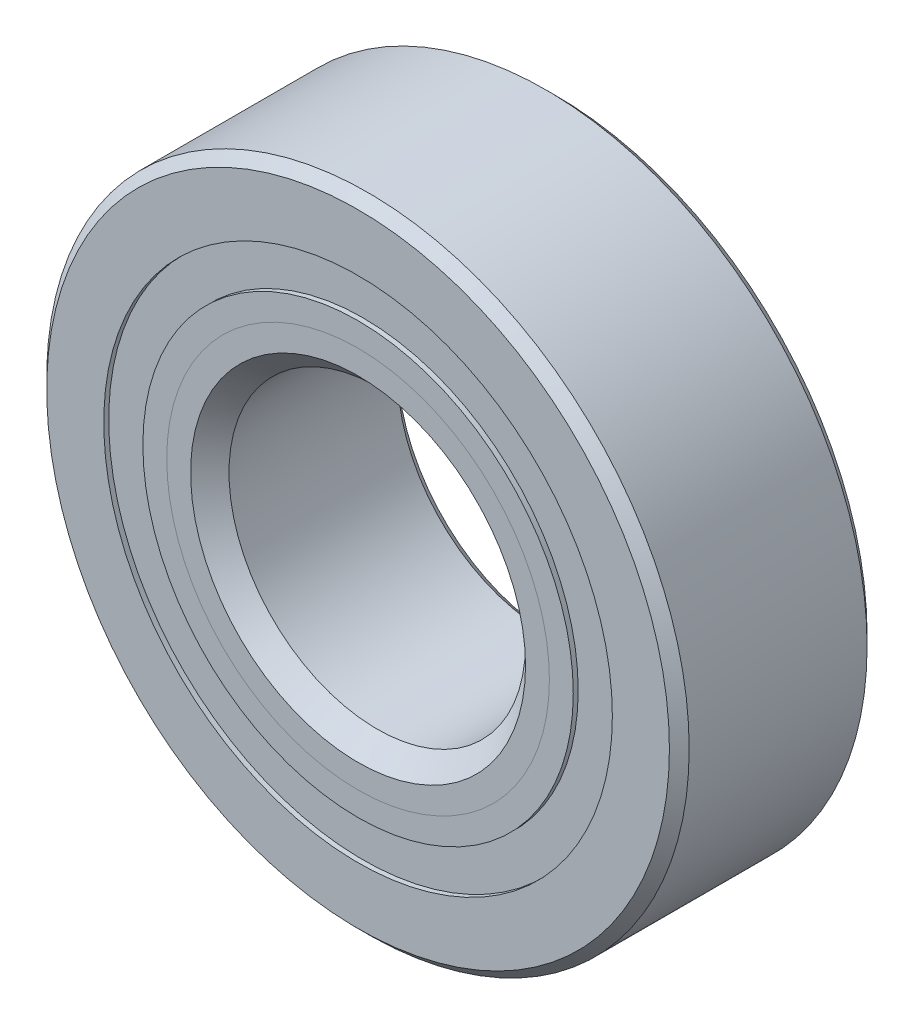
ISO-10303-21;
HEADER;
FILE_DESCRIPTION(('STEP AP214'),'2;1');
FILE_NAME('part.step','',(''),(''),'','','');
FILE_SCHEMA(('AUTOMOTIVE_DESIGN { 1 0 10303 214 1 1 1 1 }'));
ENDSEC;
DATA;
#1=APPLICATION_CONTEXT('core data for automotive mechanical design processes');
#2=APPLICATION_PROTOCOL_DEFINITION('international standard','automotive_design',2000,#1);
#3=PRODUCT_CONTEXT('',#1,'mechanical');
#4=PRODUCT('Part','Part','',(#3));
#5=PRODUCT_RELATED_PRODUCT_CATEGORY('part','',(#4));
#6=PRODUCT_DEFINITION_FORMATION('','',#4);
#7=PRODUCT_DEFINITION_CONTEXT('part definition',#1,'design');
#8=PRODUCT_DEFINITION('design','',#6,#7);
#9=PRODUCT_DEFINITION_SHAPE('','',#8);
#10=(LENGTH_UNIT() NAMED_UNIT(*) SI_UNIT(.MILLI.,.METRE.));
#11=(NAMED_UNIT(*) PLANE_ANGLE_UNIT() SI_UNIT($,.RADIAN.));
#12=(NAMED_UNIT(*) SI_UNIT($,.STERADIAN.) SOLID_ANGLE_UNIT());
#13=UNCERTAINTY_MEASURE_WITH_UNIT(LENGTH_MEASURE(1.E-05),#10,'distance_accuracy_value','');
#14=(GEOMETRIC_REPRESENTATION_CONTEXT(3) GLOBAL_UNCERTAINTY_ASSIGNED_CONTEXT((#13)) GLOBAL_UNIT_ASSIGNED_CONTEXT((#10,
#11,#12)) REPRESENTATION_CONTEXT('',''));
#15=CARTESIAN_POINT('',(0.,0.,0.));
#16=DIRECTION('',(0.,0.,1.));
#17=DIRECTION('',(1.,0.,0.));
#18=AXIS2_PLACEMENT_3D('',#15,#16,#17);
#19=CARTESIAN_POINT('',(0.,16.337293956044,-6.0325));
#20=DIRECTION('',(0.,0.,1.));
#21=DIRECTION('',(1.,0.,0.));
#22=AXIS2_PLACEMENT_3D('',#19,#20,#21);
#23=PLANE('',#22);
#24=CARTESIAN_POINT('',(0.,0.,-6.0325));
#25=DIRECTION('',(0.,0.,1.));
#26=DIRECTION('',(1.,0.,0.));
#27=AXIS2_PLACEMENT_3D('',#24,#25,#26);
#28=CIRCLE('',#27,16.337293956044);
#29=CARTESIAN_POINT('',(16.337293956044,0.,-6.0325));
#30=VERTEX_POINT('',#29);
#31=EDGE_CURVE('E55',#30,#30,#28,.T.);
#32=ORIENTED_EDGE('',*,*,#31,.F.);
#33=EDGE_LOOP('',(#32));
#34=FACE_BOUND('',#33,.T.);
#35=CARTESIAN_POINT('',(0.,0.,-6.0325));
#36=DIRECTION('',(0.,0.,1.));
#37=DIRECTION('',(1.,0.,0.));
#38=AXIS2_PLACEMENT_3D('',#35,#36,#37);
#39=CIRCLE('',#38,13.8252060439561);
#40=CARTESIAN_POINT('',(13.8252060439561,0.,-6.0325));
#41=VERTEX_POINT('',#40);
#42=EDGE_CURVE('E11',#41,#41,#39,.T.);
#43=ORIENTED_EDGE('',*,*,#42,.T.);
#44=EDGE_LOOP('',(#43));
#45=FACE_BOUND('',#44,.T.);
#46=ADVANCED_FACE('F41',(#34,#45),#23,.F.);
#47=CARTESIAN_POINT('',(0.,0.,6.35));
#48=DIRECTION('',(0.,0.,1.));
#49=DIRECTION('',(1.,0.,0.));
#50=AXIS2_PLACEMENT_3D('',#47,#48,#49);
#51=CYLINDRICAL_SURFACE('',#50,13.8252060439561);
#52=ORIENTED_EDGE('',*,*,#42,.F.);
#53=EDGE_LOOP('',(#52));
#54=FACE_BOUND('',#53,.T.);
#55=CARTESIAN_POINT('',(0.,0.,-3.08910742628344));
#56=DIRECTION('',(0.,0.,1.));
#57=DIRECTION('',(1.,0.,0.));
#58=AXIS2_PLACEMENT_3D('',#55,#56,#57);
#59=CIRCLE('',#58,13.8252060439561);
#60=CARTESIAN_POINT('',(13.8252060439561,0.,-3.08910742628344));
#61=VERTEX_POINT('',#60);
#62=EDGE_CURVE('E47',#61,#61,#59,.T.);
#63=ORIENTED_EDGE('',*,*,#62,.T.);
#64=EDGE_LOOP('',(#63));
#65=FACE_BOUND('',#64,.T.);
#66=ADVANCED_FACE('F64',(#54,#65),#51,.F.);
#67=CARTESIAN_POINT('',(0.,16.337293956044,-3.08910742628344));
#68=DIRECTION('',(0.,0.,-1.));
#69=DIRECTION('',(-1.,0.,0.));
#70=AXIS2_PLACEMENT_3D('',#67,#68,#69);
#71=PLANE('',#70);
#72=ORIENTED_EDGE('',*,*,#62,.F.);
#73=EDGE_LOOP('',(#72));
#74=FACE_BOUND('',#73,.T.);
#75=CARTESIAN_POINT('',(0.,0.,-3.08910742628344));
#76=DIRECTION('',(0.,0.,1.));
#77=DIRECTION('',(1.,0.,0.));
#78=AXIS2_PLACEMENT_3D('',#75,#76,#77);
#79=CIRCLE('',#78,16.337293956044);
#80=CARTESIAN_POINT('',(16.337293956044,0.,-3.08910742628344));
#81=VERTEX_POINT('',#80);
#82=EDGE_CURVE('E51',#81,#81,#79,.T.);
#83=ORIENTED_EDGE('',*,*,#82,.T.);
#84=EDGE_LOOP('',(#83));
#85=FACE_BOUND('',#84,.T.);
#86=ADVANCED_FACE('F68',(#74,#85),#71,.F.);
#87=CARTESIAN_POINT('',(0.,0.,6.35));
#88=DIRECTION('',(0.,0.,1.));
#89=DIRECTION('',(1.,0.,0.));
#90=AXIS2_PLACEMENT_3D('',#87,#88,#89);
#91=CYLINDRICAL_SURFACE('',#90,16.337293956044);
#92=ORIENTED_EDGE('',*,*,#82,.F.);
#93=EDGE_LOOP('',(#92));
#94=FACE_BOUND('',#93,.T.);
#95=ORIENTED_EDGE('',*,*,#31,.T.);
#96=EDGE_LOOP('',(#95));
#97=FACE_BOUND('',#96,.T.);
#98=ADVANCED_FACE('F61',(#94,#97),#91,.T.);
#99=CLOSED_SHELL('',(#46,#66,#86,#98));
#100=MANIFOLD_SOLID_BREP('B2',#99);
#101=CARTESIAN_POINT('',(0.,16.337293956044,6.0325));
#102=DIRECTION('',(0.,0.,-1.));
#103=DIRECTION('',(-1.,0.,0.));
#104=AXIS2_PLACEMENT_3D('',#101,#102,#103);
#105=PLANE('',#104);
#106=CARTESIAN_POINT('',(0.,0.,6.0325));
#107=DIRECTION('',(0.,0.,1.));
#108=DIRECTION('',(1.,0.,0.));
#109=AXIS2_PLACEMENT_3D('',#106,#107,#108);
#110=CIRCLE('',#109,13.8252060439561);
#111=CARTESIAN_POINT('',(13.8252060439561,0.,6.0325));
#112=VERTEX_POINT('',#111);
#113=EDGE_CURVE('E40',#112,#112,#110,.T.);
#114=ORIENTED_EDGE('',*,*,#113,.F.);
#115=EDGE_LOOP('',(#114));
#116=FACE_BOUND('',#115,.T.);
#117=CARTESIAN_POINT('',(0.,0.,6.0325));
#118=DIRECTION('',(0.,0.,1.));
#119=DIRECTION('',(1.,0.,0.));
#120=AXIS2_PLACEMENT_3D('',#117,#118,#119);
#121=CIRCLE('',#120,16.337293956044);
#122=CARTESIAN_POINT('',(16.337293956044,0.,6.0325));
#123=VERTEX_POINT('',#122);
#124=EDGE_CURVE('E122',#123,#123,#121,.T.);
#125=ORIENTED_EDGE('',*,*,#124,.T.);
#126=EDGE_LOOP('',(#125));
#127=FACE_BOUND('',#126,.T.);
#128=ADVANCED_FACE('F108',(#116,#127),#105,.F.);
#129=CARTESIAN_POINT('',(0.,0.,6.35));
#130=DIRECTION('',(0.,0.,1.));
#131=DIRECTION('',(1.,0.,0.));
#132=AXIS2_PLACEMENT_3D('',#129,#130,#131);
#133=CYLINDRICAL_SURFACE('',#132,13.8252060439561);
#134=CARTESIAN_POINT('',(0.,0.,3.08910742628344));
#135=DIRECTION('',(0.,0.,1.));
#136=DIRECTION('',(1.,0.,0.));
#137=AXIS2_PLACEMENT_3D('',#134,#135,#136);
#138=CIRCLE('',#137,13.8252060439561);
#139=CARTESIAN_POINT('',(13.8252060439561,0.,3.08910742628344));
#140=VERTEX_POINT('',#139);
#141=EDGE_CURVE('E114',#140,#140,#138,.T.);
#142=ORIENTED_EDGE('',*,*,#141,.F.);
#143=EDGE_LOOP('',(#142));
#144=FACE_BOUND('',#143,.T.);
#145=ORIENTED_EDGE('',*,*,#113,.T.);
#146=EDGE_LOOP('',(#145));
#147=FACE_BOUND('',#146,.T.);
#148=ADVANCED_FACE('F137',(#144,#147),#133,.F.);
#149=CARTESIAN_POINT('',(0.,16.337293956044,3.08910742628344));
#150=DIRECTION('',(0.,0.,1.));
#151=DIRECTION('',(1.,0.,0.));
#152=AXIS2_PLACEMENT_3D('',#149,#150,#151);
#153=PLANE('',#152);
#154=CARTESIAN_POINT('',(0.,0.,3.08910742628344));
#155=DIRECTION('',(0.,0.,1.));
#156=DIRECTION('',(1.,0.,0.));
#157=AXIS2_PLACEMENT_3D('',#154,#155,#156);
#158=CIRCLE('',#157,16.337293956044);
#159=CARTESIAN_POINT('',(16.337293956044,0.,3.08910742628344));
#160=VERTEX_POINT('',#159);
#161=EDGE_CURVE('E118',#160,#160,#158,.T.);
#162=ORIENTED_EDGE('',*,*,#161,.F.);
#163=EDGE_LOOP('',(#162));
#164=FACE_BOUND('',#163,.T.);
#165=ORIENTED_EDGE('',*,*,#141,.T.);
#166=EDGE_LOOP('',(#165));
#167=FACE_BOUND('',#166,.T.);
#168=ADVANCED_FACE('F132',(#164,#167),#153,.F.);
#169=CARTESIAN_POINT('',(0.,0.,6.35));
#170=DIRECTION('',(0.,0.,1.));
#171=DIRECTION('',(1.,0.,0.));
#172=AXIS2_PLACEMENT_3D('',#169,#170,#171);
#173=CYLINDRICAL_SURFACE('',#172,16.337293956044);
#174=ORIENTED_EDGE('',*,*,#124,.F.);
#175=EDGE_LOOP('',(#174));
#176=FACE_BOUND('',#175,.T.);
#177=ORIENTED_EDGE('',*,*,#161,.T.);
#178=EDGE_LOOP('',(#177));
#179=FACE_BOUND('',#178,.T.);
#180=ADVANCED_FACE('F129',(#176,#179),#173,.T.);
#181=CLOSED_SHELL('',(#128,#148,#168,#180));
#182=MANIFOLD_SOLID_BREP('B6',#181);
#183=CARTESIAN_POINT('',(-6.5435091405665,13.5877367390534,0.));
#184=DIRECTION('',(0.,0.,1.));
#185=DIRECTION('',(-0.433883739117546,0.900968867902425,0.));
#186=AXIS2_PLACEMENT_3D('',#183,#184,#185);
#187=SPHERICAL_SURFACE('',#186,3.08910742628344);
#188=CARTESIAN_POINT('',(-6.5435091405665,13.5877367390534,3.08910742628344));
#189=VERTEX_POINT('',#188);
#190=VERTEX_LOOP('',#189);
#191=FACE_BOUND('',#190,.T.);
#192=ADVANCED_FACE('F175',(#191),#187,.T.);
#193=CLOSED_SHELL('',(#192));
#194=MANIFOLD_SOLID_BREP('B35',#193);
#195=CARTESIAN_POINT('',(-11.7909960449709,9.40300557428217,0.));
#196=DIRECTION('',(0.,0.,1.));
#197=DIRECTION('',(-0.781831482468022,0.623489801858743,0.));
#198=AXIS2_PLACEMENT_3D('',#195,#196,#197);
#199=SPHERICAL_SURFACE('',#198,3.08910742628344);
#200=CARTESIAN_POINT('',(-11.7909960449709,9.40300557428217,3.08910742628344));
#201=VERTEX_POINT('',#200);
#202=VERTEX_LOOP('',#201);
#203=FACE_BOUND('',#202,.T.);
#204=ADVANCED_FACE('F195',(#203),#199,.T.);
#205=CLOSED_SHELL('',(#204));
#206=MANIFOLD_SOLID_BREP('B104',#205);
#207=CARTESIAN_POINT('',(-14.7031315755921,3.35589383522882,0.));
#208=DIRECTION('',(0.,0.,1.));
#209=DIRECTION('',(-0.974927912181821,0.222520933956325,0.));
#210=AXIS2_PLACEMENT_3D('',#207,#208,#209);
#211=SPHERICAL_SURFACE('',#210,3.08910742628344);
#212=CARTESIAN_POINT('',(-14.7031315755921,3.35589383522882,3.08910742628344));
#213=VERTEX_POINT('',#212);
#214=VERTEX_LOOP('',#213);
#215=FACE_BOUND('',#214,.T.);
#216=ADVANCED_FACE('F215',(#215),#211,.T.);
#217=CLOSED_SHELL('',(#216));
#218=MANIFOLD_SOLID_BREP('B171',#217);
#219=CARTESIAN_POINT('',(-14.7031315755922,-3.35589383522853,0.));
#220=DIRECTION('',(0.,0.,1.));
#221=DIRECTION('',(-0.974927912181826,-0.222520933956305,0.));
#222=AXIS2_PLACEMENT_3D('',#219,#220,#221);
#223=SPHERICAL_SURFACE('',#222,3.08910742628344);
#224=CARTESIAN_POINT('',(-14.7031315755922,-3.35589383522853,3.08910742628344));
#225=VERTEX_POINT('',#224);
#226=VERTEX_LOOP('',#225);
#227=FACE_BOUND('',#226,.T.);
#228=ADVANCED_FACE('F246',(#227),#223,.T.);
#229=CLOSED_SHELL('',(#228));
#230=MANIFOLD_SOLID_BREP('B191',#229);
#231=CARTESIAN_POINT('',(-11.7909960449711,-9.40300557428192,0.));
#232=DIRECTION('',(0.,0.,1.));
#233=DIRECTION('',(-0.781831482468035,-0.623489801858727,0.));
#234=AXIS2_PLACEMENT_3D('',#231,#232,#233);
#235=SPHERICAL_SURFACE('',#234,3.08910742628344);
#236=CARTESIAN_POINT('',(-11.7909960449711,-9.40300557428192,3.08910742628344));
#237=VERTEX_POINT('',#236);
#238=VERTEX_LOOP('',#237);
#239=FACE_BOUND('',#238,.T.);
#240=ADVANCED_FACE('F275',(#239),#235,.T.);
#241=CLOSED_SHELL('',(#240));
#242=MANIFOLD_SOLID_BREP('B211',#241);
#243=CARTESIAN_POINT('',(-6.54350914056678,-13.5877367390533,0.));
#244=DIRECTION('',(0.,0.,1.));
#245=DIRECTION('',(-0.433883739117565,-0.900968867902416,0.));
#246=AXIS2_PLACEMENT_3D('',#243,#244,#245);
#247=SPHERICAL_SURFACE('',#246,3.08910742628344);
#248=CARTESIAN_POINT('',(-6.54350914056678,-13.5877367390533,3.08910742628344));
#249=VERTEX_POINT('',#248);
#250=VERTEX_LOOP('',#249);
#251=FACE_BOUND('',#250,.T.);
#252=ADVANCED_FACE('F306',(#251),#247,.T.);
#253=CLOSED_SHELL('',(#252));
#254=MANIFOLD_SOLID_BREP('B242',#253);
#255=CARTESIAN_POINT('',(-1.05311866879462E-13,-15.08125,0.));
#256=DIRECTION('',(0.,0.,1.));
#257=DIRECTION('',(0.,-1.,0.));
#258=AXIS2_PLACEMENT_3D('',#255,#256,#257);
#259=SPHERICAL_SURFACE('',#258,3.08910742628344);
#260=CARTESIAN_POINT('',(-1.05311866879462E-13,-15.08125,3.08910742628344));
#261=VERTEX_POINT('',#260);
#262=VERTEX_LOOP('',#261);
#263=FACE_BOUND('',#262,.T.);
#264=ADVANCED_FACE('F337',(#263),#259,.T.);
#265=CLOSED_SHELL('',(#264));
#266=MANIFOLD_SOLID_BREP('B271',#265);
#267=CARTESIAN_POINT('',(6.54350914056659,-13.5877367390534,0.));
#268=DIRECTION('',(0.,0.,1.));
#269=DIRECTION('',(0.433883739117553,-0.900968867902422,0.));
#270=AXIS2_PLACEMENT_3D('',#267,#268,#269);
#271=SPHERICAL_SURFACE('',#270,3.08910742628344);
#272=CARTESIAN_POINT('',(6.54350914056659,-13.5877367390534,3.08910742628344));
#273=VERTEX_POINT('',#272);
#274=VERTEX_LOOP('',#273);
#275=FACE_BOUND('',#274,.T.);
#276=ADVANCED_FACE('F368',(#275),#271,.T.);
#277=CLOSED_SHELL('',(#276));
#278=MANIFOLD_SOLID_BREP('B302',#277);
#279=CARTESIAN_POINT('',(11.7909960449709,-9.40300557428208,0.));
#280=DIRECTION('',(0.,0.,1.));
#281=DIRECTION('',(0.781831482468027,-0.623489801858737,0.));
#282=AXIS2_PLACEMENT_3D('',#279,#280,#281);
#283=SPHERICAL_SURFACE('',#282,3.08910742628344);
#284=CARTESIAN_POINT('',(11.7909960449709,-9.40300557428208,3.08910742628344));
#285=VERTEX_POINT('',#284);
#286=VERTEX_LOOP('',#285);
#287=FACE_BOUND('',#286,.T.);
#288=ADVANCED_FACE('F399',(#287),#283,.T.);
#289=CLOSED_SHELL('',(#288));
#290=MANIFOLD_SOLID_BREP('B333',#289);
#291=CARTESIAN_POINT('',(14.7031315755921,-3.35589383522872,0.));
#292=DIRECTION('',(0.,0.,1.));
#293=DIRECTION('',(0.974927912181823,-0.222520933956318,0.));
#294=AXIS2_PLACEMENT_3D('',#291,#292,#293);
#295=SPHERICAL_SURFACE('',#294,3.08910742628344);
#296=CARTESIAN_POINT('',(14.7031315755921,-3.35589383522872,3.08910742628344));
#297=VERTEX_POINT('',#296);
#298=VERTEX_LOOP('',#297);
#299=FACE_BOUND('',#298,.T.);
#300=ADVANCED_FACE('F428',(#299),#295,.T.);
#301=CLOSED_SHELL('',(#300));
#302=MANIFOLD_SOLID_BREP('B364',#301);
#303=CARTESIAN_POINT('',(14.7031315755921,3.35589383522862,0.));
#304=DIRECTION('',(0.,0.,1.));
#305=DIRECTION('',(0.974927912181824,0.222520933956311,0.));
#306=AXIS2_PLACEMENT_3D('',#303,#304,#305);
#307=SPHERICAL_SURFACE('',#306,3.08910742628344);
#308=CARTESIAN_POINT('',(14.7031315755921,3.35589383522862,3.08910742628344));
#309=VERTEX_POINT('',#308);
#310=VERTEX_LOOP('',#309);
#311=FACE_BOUND('',#310,.T.);
#312=ADVANCED_FACE('F457',(#311),#307,.T.);
#313=CLOSED_SHELL('',(#312));
#314=MANIFOLD_SOLID_BREP('B395',#313);
#315=CARTESIAN_POINT('',(11.790996044971,9.403005574282,0.));
#316=DIRECTION('',(0.,0.,1.));
#317=DIRECTION('',(0.781831482468031,0.623489801858732,0.));
#318=AXIS2_PLACEMENT_3D('',#315,#316,#317);
#319=SPHERICAL_SURFACE('',#318,3.08910742628344);
#320=CARTESIAN_POINT('',(11.790996044971,9.403005574282,3.08910742628344));
#321=VERTEX_POINT('',#320);
#322=VERTEX_LOOP('',#321);
#323=FACE_BOUND('',#322,.T.);
#324=ADVANCED_FACE('F486',(#323),#319,.T.);
#325=CLOSED_SHELL('',(#324));
#326=MANIFOLD_SOLID_BREP('B424',#325);
#327=CARTESIAN_POINT('',(6.54350914056669,13.5877367390534,0.));
#328=DIRECTION('',(0.,0.,1.));
#329=DIRECTION('',(0.433883739117559,0.900968867902419,0.));
#330=AXIS2_PLACEMENT_3D('',#327,#328,#329);
#331=SPHERICAL_SURFACE('',#330,3.08910742628344);
#332=CARTESIAN_POINT('',(6.54350914056669,13.5877367390534,3.08910742628344));
#333=VERTEX_POINT('',#332);
#334=VERTEX_LOOP('',#333);
#335=FACE_BOUND('',#334,.T.);
#336=ADVANCED_FACE('F515',(#335),#331,.T.);
#337=CLOSED_SHELL('',(#336));
#338=MANIFOLD_SOLID_BREP('B453',#337);
#339=CARTESIAN_POINT('',(0.,15.08125,0.));
#340=DIRECTION('',(0.,0.,1.));
#341=DIRECTION('',(0.,1.,0.));
#342=AXIS2_PLACEMENT_3D('',#339,#340,#341);
#343=SPHERICAL_SURFACE('',#342,3.08910742628344);
#344=CARTESIAN_POINT('',(0.,15.08125,3.08910742628344));
#345=VERTEX_POINT('',#344);
#346=VERTEX_LOOP('',#345);
#347=FACE_BOUND('',#346,.T.);
#348=ADVANCED_FACE('F548',(#347),#343,.T.);
#349=CLOSED_SHELL('',(#348));
#350=MANIFOLD_SOLID_BREP('B482',#349);
#351=CARTESIAN_POINT('',(0.,12.2918886654072,6.35));
#352=DIRECTION('',(0.,0.,-1.));
#353=DIRECTION('',(-1.,0.,0.));
#354=AXIS2_PLACEMENT_3D('',#351,#352,#353);
#355=PLANE('',#354);
#356=CARTESIAN_POINT('',(0.,0.,6.35));
#357=DIRECTION('',(0.,0.,1.));
#358=DIRECTION('',(1.,0.,0.));
#359=AXIS2_PLACEMENT_3D('',#356,#357,#358);
#360=CIRCLE('',#359,10.7585712868583);
#361=CARTESIAN_POINT('',(10.7585712868583,0.,6.35));
#362=VERTEX_POINT('',#361);
#363=EDGE_CURVE('E602',#362,#362,#360,.T.);
#364=ORIENTED_EDGE('',*,*,#363,.F.);
#365=EDGE_LOOP('',(#364));
#366=FACE_BOUND('',#365,.T.);
#367=CARTESIAN_POINT('',(0.,0.,6.35));
#368=DIRECTION('',(0.,0.,1.));
#369=DIRECTION('',(1.,0.,0.));
#370=AXIS2_PLACEMENT_3D('',#367,#368,#369);
#371=CIRCLE('',#370,12.2918886654072);
#372=CARTESIAN_POINT('',(12.2918886654072,0.,6.35));
#373=VERTEX_POINT('',#372);
#374=EDGE_CURVE('E547',#373,#373,#371,.T.);
#375=ORIENTED_EDGE('',*,*,#374,.T.);
#376=EDGE_LOOP('',(#375));
#377=FACE_BOUND('',#376,.T.);
#378=ADVANCED_FACE('F568',(#366,#377),#355,.F.);
#379=CARTESIAN_POINT('',(0.,0.,4.81668262145112));
#380=DIRECTION('',(0.,0.,1.));
#381=DIRECTION('',(1.,0.,0.));
#382=AXIS2_PLACEMENT_3D('',#379,#380,#381);
#383=CONICAL_SURFACE('',#382,10.7585712868583,0.78539816339745);
#384=ORIENTED_EDGE('',*,*,#374,.F.);
#385=EDGE_LOOP('',(#384));
#386=FACE_BOUND('',#385,.T.);
#387=CARTESIAN_POINT('',(0.,0.,4.81668262145112));
#388=DIRECTION('',(0.,0.,1.));
#389=DIRECTION('',(1.,0.,0.));
#390=AXIS2_PLACEMENT_3D('',#387,#388,#389);
#391=CIRCLE('',#390,10.7585712868583);
#392=CARTESIAN_POINT('',(10.7585712868583,0.,4.81668262145112));
#393=VERTEX_POINT('',#392);
#394=EDGE_CURVE('E574',#393,#393,#391,.T.);
#395=ORIENTED_EDGE('',*,*,#394,.T.);
#396=EDGE_LOOP('',(#395));
#397=FACE_BOUND('',#396,.T.);
#398=ADVANCED_FACE('F609',(#386,#397),#383,.T.);
#399=CARTESIAN_POINT('',(0.,0.,6.35));
#400=DIRECTION('',(0.,0.,1.));
#401=DIRECTION('',(1.,0.,0.));
#402=AXIS2_PLACEMENT_3D('',#399,#400,#401);
#403=CYLINDRICAL_SURFACE('',#402,10.7585712868583);
#404=ORIENTED_EDGE('',*,*,#394,.F.);
#405=EDGE_LOOP('',(#404));
#406=FACE_BOUND('',#405,.T.);
#407=CARTESIAN_POINT('',(0.,0.,0.));
#408=DIRECTION('',(0.,0.,1.));
#409=DIRECTION('',(1.,0.,0.));
#410=AXIS2_PLACEMENT_3D('',#407,#408,#409);
#411=CIRCLE('',#410,10.7585712868583);
#412=CARTESIAN_POINT('',(10.7585712868583,0.,0.));
#413=VERTEX_POINT('',#412);
#414=EDGE_CURVE('E578',#413,#413,#411,.T.);
#415=ORIENTED_EDGE('',*,*,#414,.T.);
#416=EDGE_LOOP('',(#415));
#417=FACE_BOUND('',#416,.T.);
#418=ADVANCED_FACE('F613',(#406,#417),#403,.T.);
#419=CARTESIAN_POINT('',(0.,10.7585712868583,0.));
#420=DIRECTION('',(0.,0.,-1.));
#421=DIRECTION('',(-1.,0.,0.));
#422=AXIS2_PLACEMENT_3D('',#419,#420,#421);
#423=PLANE('',#422);
#424=ORIENTED_EDGE('',*,*,#414,.F.);
#425=EDGE_LOOP('',(#424));
#426=FACE_BOUND('',#425,.T.);
#427=CARTESIAN_POINT('',(0.,0.,0.));
#428=DIRECTION('',(0.,0.,1.));
#429=DIRECTION('',(1.,0.,0.));
#430=AXIS2_PLACEMENT_3D('',#427,#428,#429);
#431=CIRCLE('',#430,11.9921425737166);
#432=CARTESIAN_POINT('',(11.9921425737166,0.,0.));
#433=VERTEX_POINT('',#432);
#434=EDGE_CURVE('E582',#433,#433,#431,.T.);
#435=ORIENTED_EDGE('',*,*,#434,.T.);
#436=EDGE_LOOP('',(#435));
#437=FACE_BOUND('',#436,.T.);
#438=ADVANCED_FACE('F618',(#426,#437),#423,.F.);
#439=CARTESIAN_POINT('',(0.,0.,0.));
#440=DIRECTION('',(0.,0.,1.));
#441=DIRECTION('',(1.,0.,0.));
#442=AXIS2_PLACEMENT_3D('',#439,#440,#441);
#443=TOROIDAL_SURFACE('',#442,15.08125,3.08910742628344);
#444=ORIENTED_EDGE('',*,*,#434,.F.);
#445=EDGE_LOOP('',(#444));
#446=FACE_BOUND('',#445,.T.);
#447=CARTESIAN_POINT('',(0.,0.,-2.82222222222222));
#448=DIRECTION('',(0.,0.,1.));
#449=DIRECTION('',(1.,0.,0.));
#450=AXIS2_PLACEMENT_3D('',#447,#448,#449);
#451=CIRCLE('',#450,13.8252060439561);
#452=CARTESIAN_POINT('',(13.8252060439561,0.,-2.82222222222222));
#453=VERTEX_POINT('',#452);
#454=EDGE_CURVE('E587',#453,#453,#451,.T.);
#455=ORIENTED_EDGE('',*,*,#454,.T.);
#456=EDGE_LOOP('',(#455));
#457=FACE_BOUND('',#456,.T.);
#458=ADVANCED_FACE('F624',(#446,#457),#443,.F.);
#459=CARTESIAN_POINT('',(0.,0.,6.35));
#460=DIRECTION('',(0.,0.,1.));
#461=DIRECTION('',(1.,0.,0.));
#462=AXIS2_PLACEMENT_3D('',#459,#460,#461);
#463=CYLINDRICAL_SURFACE('',#462,13.8252060439561);
#464=ORIENTED_EDGE('',*,*,#454,.F.);
#465=EDGE_LOOP('',(#464));
#466=FACE_BOUND('',#465,.T.);
#467=CARTESIAN_POINT('',(0.,0.,-6.35));
#468=DIRECTION('',(0.,0.,1.));
#469=DIRECTION('',(1.,0.,0.));
#470=AXIS2_PLACEMENT_3D('',#467,#468,#469);
#471=CIRCLE('',#470,13.8252060439561);
#472=CARTESIAN_POINT('',(13.8252060439561,0.,-6.35));
#473=VERTEX_POINT('',#472);
#474=EDGE_CURVE('E590',#473,#473,#471,.T.);
#475=ORIENTED_EDGE('',*,*,#474,.T.);
#476=EDGE_LOOP('',(#475));
#477=FACE_BOUND('',#476,.T.);
#478=ADVANCED_FACE('F628',(#466,#477),#463,.T.);
#479=CARTESIAN_POINT('',(0.,10.16,-6.35));
#480=DIRECTION('',(0.,0.,1.));
#481=DIRECTION('',(1.,0.,0.));
#482=AXIS2_PLACEMENT_3D('',#479,#480,#481);
#483=PLANE('',#482);
#484=ORIENTED_EDGE('',*,*,#474,.F.);
#485=EDGE_LOOP('',(#484));
#486=FACE_BOUND('',#485,.T.);
#487=CARTESIAN_POINT('',(0.,0.,-6.35));
#488=DIRECTION('',(0.,0.,1.));
#489=DIRECTION('',(1.,0.,0.));
#490=AXIS2_PLACEMENT_3D('',#487,#488,#489);
#491=CIRCLE('',#490,10.16);
#492=CARTESIAN_POINT('',(10.16,0.,-6.35));
#493=VERTEX_POINT('',#492);
#494=EDGE_CURVE('E593',#493,#493,#491,.T.);
#495=ORIENTED_EDGE('',*,*,#494,.T.);
#496=EDGE_LOOP('',(#495));
#497=FACE_BOUND('',#496,.T.);
#498=ADVANCED_FACE('F632',(#486,#497),#483,.F.);
#499=CARTESIAN_POINT('',(0.,0.,-5.715));
#500=DIRECTION('',(0.,0.,-1.));
#501=DIRECTION('',(-1.,0.,0.));
#502=AXIS2_PLACEMENT_3D('',#499,#500,#501);
#503=CONICAL_SURFACE('',#502,9.525,0.785398163397446);
#504=ORIENTED_EDGE('',*,*,#494,.F.);
#505=EDGE_LOOP('',(#504));
#506=FACE_BOUND('',#505,.T.);
#507=CARTESIAN_POINT('',(0.,0.,-5.715));
#508=DIRECTION('',(0.,0.,1.));
#509=DIRECTION('',(1.,0.,0.));
#510=AXIS2_PLACEMENT_3D('',#507,#508,#509);
#511=CIRCLE('',#510,9.525);
#512=CARTESIAN_POINT('',(9.525,0.,-5.715));
#513=VERTEX_POINT('',#512);
#514=EDGE_CURVE('E596',#513,#513,#511,.T.);
#515=ORIENTED_EDGE('',*,*,#514,.T.);
#516=EDGE_LOOP('',(#515));
#517=FACE_BOUND('',#516,.T.);
#518=ADVANCED_FACE('F636',(#506,#517),#503,.F.);
#519=CARTESIAN_POINT('',(0.,0.,6.35));
#520=DIRECTION('',(0.,0.,1.));
#521=DIRECTION('',(1.,0.,0.));
#522=AXIS2_PLACEMENT_3D('',#519,#520,#521);
#523=CYLINDRICAL_SURFACE('',#522,9.525);
#524=ORIENTED_EDGE('',*,*,#514,.F.);
#525=EDGE_LOOP('',(#524));
#526=FACE_BOUND('',#525,.T.);
#527=CARTESIAN_POINT('',(0.,0.,5.11642871314173));
#528=DIRECTION('',(0.,0.,1.));
#529=DIRECTION('',(1.,0.,0.));
#530=AXIS2_PLACEMENT_3D('',#527,#528,#529);
#531=CIRCLE('',#530,9.525);
#532=CARTESIAN_POINT('',(9.525,0.,5.11642871314173));
#533=VERTEX_POINT('',#532);
#534=EDGE_CURVE('E599',#533,#533,#531,.T.);
#535=ORIENTED_EDGE('',*,*,#534,.T.);
#536=EDGE_LOOP('',(#535));
#537=FACE_BOUND('',#536,.T.);
#538=ADVANCED_FACE('F640',(#526,#537),#523,.F.);
#539=CARTESIAN_POINT('',(0.,0.,6.35));
#540=DIRECTION('',(0.,0.,1.));
#541=DIRECTION('',(1.,0.,0.));
#542=AXIS2_PLACEMENT_3D('',#539,#540,#541);
#543=CONICAL_SURFACE('',#542,10.7585712868583,0.78539816339745);
#544=ORIENTED_EDGE('',*,*,#534,.F.);
#545=EDGE_LOOP('',(#544));
#546=FACE_BOUND('',#545,.T.);
#547=ORIENTED_EDGE('',*,*,#363,.T.);
#548=EDGE_LOOP('',(#547));
#549=FACE_BOUND('',#548,.T.);
#550=ADVANCED_FACE('F606',(#546,#549),#543,.F.);
#551=CLOSED_SHELL('',(#378,#398,#418,#438,#458,#478,#498,#518,#538,#550));
#552=MANIFOLD_SOLID_BREP('B511',#551);
#553=CARTESIAN_POINT('',(0.,13.8252060439561,6.35));
#554=DIRECTION('',(0.,0.,-1.));
#555=DIRECTION('',(-1.,0.,0.));
#556=AXIS2_PLACEMENT_3D('',#553,#554,#555);
#557=PLANE('',#556);
#558=CARTESIAN_POINT('',(0.,0.,6.35));
#559=DIRECTION('',(0.,0.,1.));
#560=DIRECTION('',(1.,0.,0.));
#561=AXIS2_PLACEMENT_3D('',#558,#559,#560);
#562=CIRCLE('',#561,12.2918886654072);
#563=CARTESIAN_POINT('',(12.2918886654072,0.,6.35));
#564=VERTEX_POINT('',#563);
#565=EDGE_CURVE('E567',#564,#564,#562,.T.);
#566=ORIENTED_EDGE('',*,*,#565,.F.);
#567=EDGE_LOOP('',(#566));
#568=FACE_BOUND('',#567,.T.);
#569=CARTESIAN_POINT('',(0.,0.,6.35));
#570=DIRECTION('',(0.,0.,1.));
#571=DIRECTION('',(1.,0.,0.));
#572=AXIS2_PLACEMENT_3D('',#569,#570,#571);
#573=CIRCLE('',#572,13.8252060439561);
#574=CARTESIAN_POINT('',(13.8252060439561,0.,6.35));
#575=VERTEX_POINT('',#574);
#576=EDGE_CURVE('E748',#575,#575,#573,.T.);
#577=ORIENTED_EDGE('',*,*,#576,.T.);
#578=EDGE_LOOP('',(#577));
#579=FACE_BOUND('',#578,.T.);
#580=ADVANCED_FACE('F726',(#568,#579),#557,.F.);
#581=CARTESIAN_POINT('',(0.,0.,6.35));
#582=DIRECTION('',(0.,0.,1.));
#583=DIRECTION('',(1.,0.,0.));
#584=AXIS2_PLACEMENT_3D('',#581,#582,#583);
#585=CONICAL_SURFACE('',#584,12.2918886654072,0.78539816339745);
#586=CARTESIAN_POINT('',(0.,0.,4.81668262145112));
#587=DIRECTION('',(0.,0.,1.));
#588=DIRECTION('',(1.,0.,0.));
#589=AXIS2_PLACEMENT_3D('',#586,#587,#588);
#590=CIRCLE('',#589,10.7585712868583);
#591=CARTESIAN_POINT('',(10.7585712868583,0.,4.81668262145112));
#592=VERTEX_POINT('',#591);
#593=EDGE_CURVE('E732',#592,#592,#590,.T.);
#594=ORIENTED_EDGE('',*,*,#593,.F.);
#595=EDGE_LOOP('',(#594));
#596=FACE_BOUND('',#595,.T.);
#597=ORIENTED_EDGE('',*,*,#565,.T.);
#598=EDGE_LOOP('',(#597));
#599=FACE_BOUND('',#598,.T.);
#600=ADVANCED_FACE('F773',(#596,#599),#585,.F.);
#601=CARTESIAN_POINT('',(0.,0.,6.35));
#602=DIRECTION('',(0.,0.,1.));
#603=DIRECTION('',(1.,0.,0.));
#604=AXIS2_PLACEMENT_3D('',#601,#602,#603);
#605=CYLINDRICAL_SURFACE('',#604,10.7585712868583);
#606=CARTESIAN_POINT('',(0.,0.,0.));
#607=DIRECTION('',(0.,0.,1.));
#608=DIRECTION('',(1.,0.,0.));
#609=AXIS2_PLACEMENT_3D('',#606,#607,#608);
#610=CIRCLE('',#609,10.7585712868583);
#611=CARTESIAN_POINT('',(10.7585712868583,0.,0.));
#612=VERTEX_POINT('',#611);
#613=EDGE_CURVE('E736',#612,#612,#610,.T.);
#614=ORIENTED_EDGE('',*,*,#613,.F.);
#615=EDGE_LOOP('',(#614));
#616=FACE_BOUND('',#615,.T.);
#617=ORIENTED_EDGE('',*,*,#593,.T.);
#618=EDGE_LOOP('',(#617));
#619=FACE_BOUND('',#618,.T.);
#620=ADVANCED_FACE('F768',(#616,#619),#605,.F.);
#621=CARTESIAN_POINT('',(0.,10.7585712868583,0.));
#622=DIRECTION('',(0.,0.,1.));
#623=DIRECTION('',(1.,0.,0.));
#624=AXIS2_PLACEMENT_3D('',#621,#622,#623);
#625=PLANE('',#624);
#626=CARTESIAN_POINT('',(0.,0.,0.));
#627=DIRECTION('',(0.,0.,1.));
#628=DIRECTION('',(1.,0.,0.));
#629=AXIS2_PLACEMENT_3D('',#626,#627,#628);
#630=CIRCLE('',#629,11.9921425737166);
#631=CARTESIAN_POINT('',(11.9921425737166,0.,0.));
#632=VERTEX_POINT('',#631);
#633=EDGE_CURVE('E740',#632,#632,#630,.T.);
#634=ORIENTED_EDGE('',*,*,#633,.F.);
#635=EDGE_LOOP('',(#634));
#636=FACE_BOUND('',#635,.T.);
#637=ORIENTED_EDGE('',*,*,#613,.T.);
#638=EDGE_LOOP('',(#637));
#639=FACE_BOUND('',#638,.T.);
#640=ADVANCED_FACE('F762',(#636,#639),#625,.F.);
#641=CARTESIAN_POINT('',(0.,0.,0.));
#642=DIRECTION('',(0.,0.,1.));
#643=DIRECTION('',(1.,0.,0.));
#644=AXIS2_PLACEMENT_3D('',#641,#642,#643);
#645=TOROIDAL_SURFACE('',#644,15.08125,3.08910742628344);
#646=CARTESIAN_POINT('',(0.,0.,2.82222222222222));
#647=DIRECTION('',(0.,0.,1.));
#648=DIRECTION('',(1.,0.,0.));
#649=AXIS2_PLACEMENT_3D('',#646,#647,#648);
#650=CIRCLE('',#649,13.8252060439561);
#651=CARTESIAN_POINT('',(13.8252060439561,0.,2.82222222222222));
#652=VERTEX_POINT('',#651);
#653=EDGE_CURVE('E745',#652,#652,#650,.T.);
#654=ORIENTED_EDGE('',*,*,#653,.F.);
#655=EDGE_LOOP('',(#654));
#656=FACE_BOUND('',#655,.T.);
#657=ORIENTED_EDGE('',*,*,#633,.T.);
#658=EDGE_LOOP('',(#657));
#659=FACE_BOUND('',#658,.T.);
#660=ADVANCED_FACE('F756',(#656,#659),#645,.F.);
#661=CARTESIAN_POINT('',(0.,0.,6.35));
#662=DIRECTION('',(0.,0.,1.));
#663=DIRECTION('',(1.,0.,0.));
#664=AXIS2_PLACEMENT_3D('',#661,#662,#663);
#665=CYLINDRICAL_SURFACE('',#664,13.8252060439561);
#666=ORIENTED_EDGE('',*,*,#576,.F.);
#667=EDGE_LOOP('',(#666));
#668=FACE_BOUND('',#667,.T.);
#669=ORIENTED_EDGE('',*,*,#653,.T.);
#670=EDGE_LOOP('',(#669));
#671=FACE_BOUND('',#670,.T.);
#672=ADVANCED_FACE('F753',(#668,#671),#665,.T.);
#673=CLOSED_SHELL('',(#580,#600,#620,#640,#660,#672));
#674=MANIFOLD_SOLID_BREP('B542',#673);
#675=CARTESIAN_POINT('',(0.,0.,5.715));
#676=DIRECTION('',(0.,0.,-1.));
#677=DIRECTION('',(-1.,0.,0.));
#678=AXIS2_PLACEMENT_3D('',#675,#676,#677);
#679=CONICAL_SURFACE('',#678,20.6375,0.785398163397448);
#680=CARTESIAN_POINT('',(0.,0.,6.35));
#681=DIRECTION('',(0.,0.,1.));
#682=DIRECTION('',(1.,0.,0.));
#683=AXIS2_PLACEMENT_3D('',#680,#681,#682);
#684=CIRCLE('',#683,20.0025);
#685=CARTESIAN_POINT('',(20.0025,0.,6.35));
#686=VERTEX_POINT('',#685);
#687=EDGE_CURVE('E845',#686,#686,#684,.T.);
#688=ORIENTED_EDGE('',*,*,#687,.F.);
#689=EDGE_LOOP('',(#688));
#690=FACE_BOUND('',#689,.T.);
#691=CARTESIAN_POINT('',(0.,0.,5.715));
#692=DIRECTION('',(0.,0.,1.));
#693=DIRECTION('',(1.,0.,0.));
#694=AXIS2_PLACEMENT_3D('',#691,#692,#693);
#695=CIRCLE('',#694,20.6375);
#696=CARTESIAN_POINT('',(20.6375,0.,5.715));
#697=VERTEX_POINT('',#696);
#698=EDGE_CURVE('E725',#697,#697,#695,.T.);
#699=ORIENTED_EDGE('',*,*,#698,.T.);
#700=EDGE_LOOP('',(#699));
#701=FACE_BOUND('',#700,.T.);
#702=ADVANCED_FACE('F817',(#690,#701),#679,.T.);
#703=CARTESIAN_POINT('',(0.,0.,6.35));
#704=DIRECTION('',(0.,0.,1.));
#705=DIRECTION('',(1.,0.,0.));
#706=AXIS2_PLACEMENT_3D('',#703,#704,#705);
#707=CYLINDRICAL_SURFACE('',#706,20.6375);
#708=ORIENTED_EDGE('',*,*,#698,.F.);
#709=EDGE_LOOP('',(#708));
#710=FACE_BOUND('',#709,.T.);
#711=CARTESIAN_POINT('',(0.,0.,-5.715));
#712=DIRECTION('',(0.,0.,1.));
#713=DIRECTION('',(1.,0.,0.));
#714=AXIS2_PLACEMENT_3D('',#711,#712,#713);
#715=CIRCLE('',#714,20.6375);
#716=CARTESIAN_POINT('',(20.6375,0.,-5.715));
#717=VERTEX_POINT('',#716);
#718=EDGE_CURVE('E823',#717,#717,#715,.T.);
#719=ORIENTED_EDGE('',*,*,#718,.T.);
#720=EDGE_LOOP('',(#719));
#721=FACE_BOUND('',#720,.T.);
#722=ADVANCED_FACE('F852',(#710,#721),#707,.T.);
#723=CARTESIAN_POINT('',(0.,0.,-6.35));
#724=DIRECTION('',(0.,0.,1.));
#725=DIRECTION('',(1.,0.,0.));
#726=AXIS2_PLACEMENT_3D('',#723,#724,#725);
#727=CONICAL_SURFACE('',#726,20.0025,0.785398163397448);
#728=ORIENTED_EDGE('',*,*,#718,.F.);
#729=EDGE_LOOP('',(#728));
#730=FACE_BOUND('',#729,.T.);
#731=CARTESIAN_POINT('',(0.,0.,-6.35));
#732=DIRECTION('',(0.,0.,1.));
#733=DIRECTION('',(1.,0.,0.));
#734=AXIS2_PLACEMENT_3D('',#731,#732,#733);
#735=CIRCLE('',#734,20.0025);
#736=CARTESIAN_POINT('',(20.0025,0.,-6.35));
#737=VERTEX_POINT('',#736);
#738=EDGE_CURVE('E827',#737,#737,#735,.T.);
#739=ORIENTED_EDGE('',*,*,#738,.T.);
#740=EDGE_LOOP('',(#739));
#741=FACE_BOUND('',#740,.T.);
#742=ADVANCED_FACE('F856',(#730,#741),#727,.T.);
#743=CARTESIAN_POINT('',(0.,20.0025,-6.35));
#744=DIRECTION('',(0.,0.,1.));
#745=DIRECTION('',(1.,0.,0.));
#746=AXIS2_PLACEMENT_3D('',#743,#744,#745);
#747=PLANE('',#746);
#748=ORIENTED_EDGE('',*,*,#738,.F.);
#749=EDGE_LOOP('',(#748));
#750=FACE_BOUND('',#749,.T.);
#751=CARTESIAN_POINT('',(0.,0.,-6.35));
#752=DIRECTION('',(0.,0.,1.));
#753=DIRECTION('',(1.,0.,0.));
#754=AXIS2_PLACEMENT_3D('',#751,#752,#753);
#755=CIRCLE('',#754,16.337293956044);
#756=CARTESIAN_POINT('',(16.337293956044,0.,-6.35));
#757=VERTEX_POINT('',#756);
#758=EDGE_CURVE('E831',#757,#757,#755,.T.);
#759=ORIENTED_EDGE('',*,*,#758,.T.);
#760=EDGE_LOOP('',(#759));
#761=FACE_BOUND('',#760,.T.);
#762=ADVANCED_FACE('F861',(#750,#761),#747,.F.);
#763=CARTESIAN_POINT('',(0.,0.,6.35));
#764=DIRECTION('',(0.,0.,1.));
#765=DIRECTION('',(1.,0.,0.));
#766=AXIS2_PLACEMENT_3D('',#763,#764,#765);
#767=CYLINDRICAL_SURFACE('',#766,16.337293956044);
#768=ORIENTED_EDGE('',*,*,#758,.F.);
#769=EDGE_LOOP('',(#768));
#770=FACE_BOUND('',#769,.T.);
#771=CARTESIAN_POINT('',(0.,0.,-2.82222222222222));
#772=DIRECTION('',(0.,0.,1.));
#773=DIRECTION('',(1.,0.,0.));
#774=AXIS2_PLACEMENT_3D('',#771,#772,#773);
#775=CIRCLE('',#774,16.337293956044);
#776=CARTESIAN_POINT('',(16.337293956044,0.,-2.82222222222222));
#777=VERTEX_POINT('',#776);
#778=EDGE_CURVE('E836',#777,#777,#775,.T.);
#779=ORIENTED_EDGE('',*,*,#778,.T.);
#780=EDGE_LOOP('',(#779));
#781=FACE_BOUND('',#780,.T.);
#782=ADVANCED_FACE('F867',(#770,#781),#767,.F.);
#783=CARTESIAN_POINT('',(0.,0.,0.));
#784=DIRECTION('',(0.,0.,1.));
#785=DIRECTION('',(1.,0.,0.));
#786=AXIS2_PLACEMENT_3D('',#783,#784,#785);
#787=TOROIDAL_SURFACE('',#786,15.08125,3.08910742628344);
#788=ORIENTED_EDGE('',*,*,#778,.F.);
#789=EDGE_LOOP('',(#788));
#790=FACE_BOUND('',#789,.T.);
#791=CARTESIAN_POINT('',(0.,0.,2.82222222222222));
#792=DIRECTION('',(0.,0.,1.));
#793=DIRECTION('',(1.,0.,0.));
#794=AXIS2_PLACEMENT_3D('',#791,#792,#793);
#795=CIRCLE('',#794,16.337293956044);
#796=CARTESIAN_POINT('',(16.337293956044,0.,2.82222222222222));
#797=VERTEX_POINT('',#796);
#798=EDGE_CURVE('E839',#797,#797,#795,.T.);
#799=ORIENTED_EDGE('',*,*,#798,.T.);
#800=EDGE_LOOP('',(#799));
#801=FACE_BOUND('',#800,.T.);
#802=ADVANCED_FACE('F871',(#790,#801),#787,.F.);
#803=CARTESIAN_POINT('',(0.,0.,6.35));
#804=DIRECTION('',(0.,0.,1.));
#805=DIRECTION('',(1.,0.,0.));
#806=AXIS2_PLACEMENT_3D('',#803,#804,#805);
#807=CYLINDRICAL_SURFACE('',#806,16.337293956044);
#808=ORIENTED_EDGE('',*,*,#798,.F.);
#809=EDGE_LOOP('',(#808));
#810=FACE_BOUND('',#809,.T.);
#811=CARTESIAN_POINT('',(0.,0.,6.35));
#812=DIRECTION('',(0.,0.,1.));
#813=DIRECTION('',(1.,0.,0.));
#814=AXIS2_PLACEMENT_3D('',#811,#812,#813);
#815=CIRCLE('',#814,16.337293956044);
#816=CARTESIAN_POINT('',(16.337293956044,0.,6.35));
#817=VERTEX_POINT('',#816);
#818=EDGE_CURVE('E842',#817,#817,#815,.T.);
#819=ORIENTED_EDGE('',*,*,#818,.T.);
#820=EDGE_LOOP('',(#819));
#821=FACE_BOUND('',#820,.T.);
#822=ADVANCED_FACE('F875',(#810,#821),#807,.F.);
#823=CARTESIAN_POINT('',(0.,20.0025,6.35));
#824=DIRECTION('',(0.,0.,-1.));
#825=DIRECTION('',(-1.,0.,0.));
#826=AXIS2_PLACEMENT_3D('',#823,#824,#825);
#827=PLANE('',#826);
#828=ORIENTED_EDGE('',*,*,#818,.F.);
#829=EDGE_LOOP('',(#828));
#830=FACE_BOUND('',#829,.T.);
#831=ORIENTED_EDGE('',*,*,#687,.T.);
#832=EDGE_LOOP('',(#831));
#833=FACE_BOUND('',#832,.T.);
#834=ADVANCED_FACE('F849',(#830,#833),#827,.F.);
#835=CLOSED_SHELL('',(#702,#722,#742,#762,#782,#802,#822,#834));
#836=MANIFOLD_SOLID_BREP('B562',#835);
#837=ADVANCED_BREP_SHAPE_REPRESENTATION('',(#18,#100,#182,#194,#206,#218,#230,#242,#254,#266,
#278,#290,#302,#314,#326,#338,#350,#552,#674,#836),#14);
#838=SHAPE_DEFINITION_REPRESENTATION(#9,#837);
ENDSEC;
END-ISO-10303-21;
